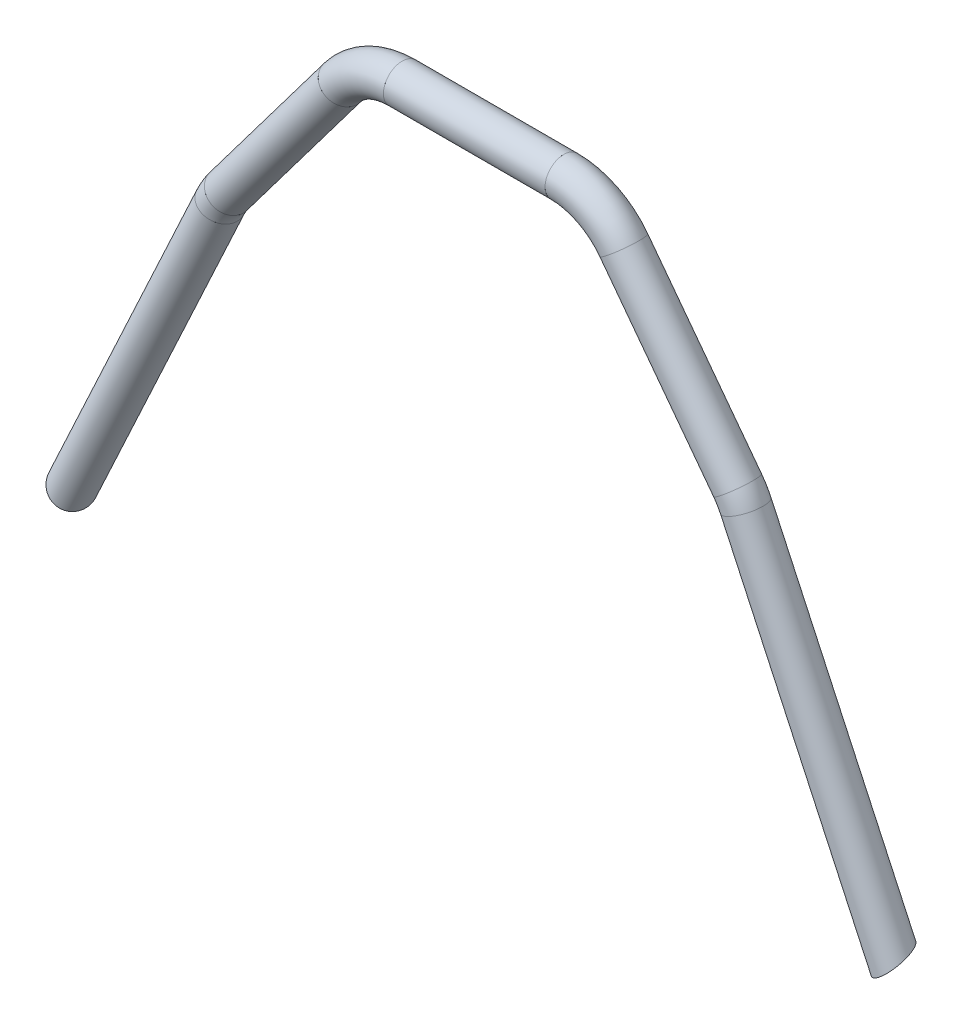
ISO-10303-21;
HEADER;
FILE_DESCRIPTION(('STEP AP214'),'2;1');
FILE_NAME('part.step','',(''),(''),'','','');
FILE_SCHEMA(('AUTOMOTIVE_DESIGN { 1 0 10303 214 1 1 1 1 }'));
ENDSEC;
DATA;
#1=APPLICATION_CONTEXT('core data for automotive mechanical design processes');
#2=APPLICATION_PROTOCOL_DEFINITION('international standard','automotive_design',2000,#1);
#3=PRODUCT_CONTEXT('',#1,'mechanical');
#4=PRODUCT('Part','Part','',(#3));
#5=PRODUCT_RELATED_PRODUCT_CATEGORY('part','',(#4));
#6=PRODUCT_DEFINITION_FORMATION('','',#4);
#7=PRODUCT_DEFINITION_CONTEXT('part definition',#1,'design');
#8=PRODUCT_DEFINITION('design','',#6,#7);
#9=PRODUCT_DEFINITION_SHAPE('','',#8);
#10=(LENGTH_UNIT() NAMED_UNIT(*) SI_UNIT(.MILLI.,.METRE.));
#11=(NAMED_UNIT(*) PLANE_ANGLE_UNIT() SI_UNIT($,.RADIAN.));
#12=(NAMED_UNIT(*) SI_UNIT($,.STERADIAN.) SOLID_ANGLE_UNIT());
#13=UNCERTAINTY_MEASURE_WITH_UNIT(LENGTH_MEASURE(1.E-05),#10,'distance_accuracy_value','');
#14=(GEOMETRIC_REPRESENTATION_CONTEXT(3) GLOBAL_UNCERTAINTY_ASSIGNED_CONTEXT((#13)) GLOBAL_UNIT_ASSIGNED_CONTEXT((#10,
#11,#12)) REPRESENTATION_CONTEXT('',''));
#15=CARTESIAN_POINT('',(0.,0.,0.));
#16=DIRECTION('',(0.,0.,1.));
#17=DIRECTION('',(1.,0.,0.));
#18=AXIS2_PLACEMENT_3D('',#15,#16,#17);
#19=CARTESIAN_POINT('',(204.,-156.,0.));
#20=DIRECTION('',(-0.421035813367489,0.907044014291467,0.));
#21=DIRECTION('',(-0.907044014291467,-0.42103581336749,0.));
#22=AXIS2_PLACEMENT_3D('',#19,#20,#21);
#23=CYLINDRICAL_SURFACE('',#22,6.35);
#24=CARTESIAN_POINT('',(208.290559359096,-165.243218892719,0.));
#25=DIRECTION('',(0.552110748805297,-0.77420389395875,-0.309486755181485));
#26=DIRECTION('',(0.267322110291044,0.515963819809947,-0.813830588019813));
#27=AXIS2_PLACEMENT_3D('',#24,#25,#26);
#28=ELLIPSE('',#27,6.79365701265662,6.35);
#29=CARTESIAN_POINT('',(210.106654088312,-161.73793766999,-5.52888588141529));
#30=VERTEX_POINT('',#29);
#31=EDGE_CURVE('E66',#30,#30,#28,.T.);
#32=ORIENTED_EDGE('',*,*,#31,.T.);
#33=EDGE_LOOP('',(#32));
#34=FACE_BOUND('',#33,.T.);
#35=CARTESIAN_POINT('',(133.28739155037,-3.66272560954052,0.));
#36=DIRECTION('',(-0.42103581336746,0.907044014291482,0.));
#37=DIRECTION('',(-0.907044014291482,-0.421035813367461,0.));
#38=AXIS2_PLACEMENT_3D('',#35,#36,#37);
#39=CIRCLE('',#38,6.35);
#40=CARTESIAN_POINT('',(127.527662059619,-6.3363030244239,0.));
#41=VERTEX_POINT('',#40);
#42=EDGE_CURVE('E53',#41,#41,#39,.T.);
#43=ORIENTED_EDGE('',*,*,#42,.T.);
#44=EDGE_LOOP('',(#43));
#45=FACE_BOUND('',#44,.T.);
#46=ADVANCED_FACE('F49',(#34,#45),#23,.F.);
#47=CARTESIAN_POINT('',(204.,-156.,0.));
#48=DIRECTION('',(-0.421035813367489,0.907044014291467,0.));
#49=DIRECTION('',(-0.907044014291467,-0.42103581336749,0.));
#50=AXIS2_PLACEMENT_3D('',#47,#48,#49);
#51=CYLINDRICAL_SURFACE('',#50,9.525);
#52=CARTESIAN_POINT('',(208.290559359096,-165.243218892719,0.));
#53=DIRECTION('',(0.552110748805297,-0.77420389395875,-0.309486755181485));
#54=DIRECTION('',(0.267322110291044,0.515963819809947,-0.813830588019813));
#55=AXIS2_PLACEMENT_3D('',#52,#53,#54);
#56=ELLIPSE('',#55,10.1904855189849,9.525);
#57=CARTESIAN_POINT('',(211.014701452921,-159.985297058626,-8.29332882212292));
#58=VERTEX_POINT('',#57);
#59=EDGE_CURVE('E58',#58,#58,#56,.T.);
#60=ORIENTED_EDGE('',*,*,#59,.F.);
#61=EDGE_LOOP('',(#60));
#62=FACE_BOUND('',#61,.T.);
#63=CARTESIAN_POINT('',(133.28739155037,-3.66272560954052,0.));
#64=DIRECTION('',(-0.42103581336746,0.907044014291482,0.));
#65=DIRECTION('',(-0.907044014291482,-0.421035813367461,0.));
#66=AXIS2_PLACEMENT_3D('',#63,#64,#65);
#67=CIRCLE('',#66,9.525);
#68=CARTESIAN_POINT('',(124.647797314243,-7.67309173186558,0.));
#69=VERTEX_POINT('',#68);
#70=EDGE_CURVE('E11',#69,#69,#67,.T.);
#71=ORIENTED_EDGE('',*,*,#70,.F.);
#72=EDGE_LOOP('',(#71));
#73=FACE_BOUND('',#72,.T.);
#74=ADVANCED_FACE('F80',(#62,#73),#51,.T.);
#75=CARTESIAN_POINT('',(201.736440615713,-166.866080536103,-7.63255151942821));
#76=DIRECTION('',(0.552110748805297,-0.77420389395875,-0.309486755181485));
#77=DIRECTION('',(0.814176924985191,0.580616857162848,0.));
#78=AXIS2_PLACEMENT_3D('',#75,#76,#77);
#79=PLANE('',#78);
#80=ORIENTED_EDGE('',*,*,#31,.F.);
#81=EDGE_LOOP('',(#80));
#82=FACE_BOUND('',#81,.T.);
#83=ORIENTED_EDGE('',*,*,#59,.T.);
#84=EDGE_LOOP('',(#83));
#85=FACE_BOUND('',#84,.T.);
#86=ADVANCED_FACE('F76',(#82,#85),#79,.T.);
#87=CARTESIAN_POINT('',(133.28739155037,-3.66272560954051,0.));
#88=DIRECTION('',(-0.42103581336746,0.907044014291482,0.));
#89=DIRECTION('',(-0.907044014291482,-0.421035813367461,0.));
#90=AXIS2_PLACEMENT_3D('',#87,#88,#89);
#91=PLANE('',#90);
#92=ORIENTED_EDGE('',*,*,#42,.F.);
#93=EDGE_LOOP('',(#92));
#94=FACE_BOUND('',#93,.T.);
#95=ORIENTED_EDGE('',*,*,#70,.T.);
#96=EDGE_LOOP('',(#95));
#97=FACE_BOUND('',#96,.T.);
#98=ADVANCED_FACE('F51',(#94,#97),#91,.T.);
#99=CLOSED_SHELL('',(#46,#74,#86,#98));
#100=MANIFOLD_SOLID_BREP('B2',#99);
#101=CARTESIAN_POINT('',(-98.7290146058647,-19.7041900988419,0.));
#102=DIRECTION('',(0.,0.,-1.));
#103=DIRECTION('',(-1.,0.,0.));
#104=AXIS2_PLACEMENT_3D('',#101,#102,#103);
#105=TOROIDAL_SURFACE('',#104,38.1,6.35);
#106=CARTESIAN_POINT('',(-133.28739155037,-3.66272560954051,0.));
#107=DIRECTION('',(-0.421035813367489,-0.907044014291466,0.));
#108=DIRECTION('',(0.907044014291467,-0.42103581336749,0.));
#109=AXIS2_PLACEMENT_3D('',#106,#107,#108);
#110=CIRCLE('',#109,6.35);
#111=CARTESIAN_POINT('',(-139.04712104112,-0.989148194656977,0.));
#112=VERTEX_POINT('',#111);
#113=EDGE_CURVE('E139',#112,#112,#110,.T.);
#114=CARTESIAN_POINT('',(-129.157027538666,3.22496228325135,0.));
#115=DIRECTION('',(0.601815023152052,0.79863551004729,0.));
#116=DIRECTION('',(-0.798635510047291,0.601815023152052,0.));
#117=AXIS2_PLACEMENT_3D('',#114,#115,#116);
#118=CIRCLE('',#117,6.35);
#119=CARTESIAN_POINT('',(-134.228363027467,7.04648768026686,0.));
#120=VERTEX_POINT('',#119);
#121=EDGE_CURVE('E48',#120,#120,#118,.T.);
#122=CARTESIAN_POINT('',(-98.7290146058647,-19.7041900988419,0.));
#123=DIRECTION('',(0.,0.,-1.));
#124=DIRECTION('',(-1.,0.,0.));
#125=AXIS2_PLACEMENT_3D('',#122,#123,#124);
#126=CIRCLE('',#125,44.45);
#127=EDGE_CURVE('',#112,#120,#126,.T.);
#128=ORIENTED_EDGE('',*,*,#113,.T.);
#129=ORIENTED_EDGE('',*,*,#121,.T.);
#130=ORIENTED_EDGE('',*,*,#127,.T.);
#131=ORIENTED_EDGE('',*,*,#127,.F.);
#132=EDGE_LOOP('',(#128,#130,#129,#131));
#133=FACE_BOUND('',#132,.T.);
#134=ADVANCED_FACE('F126',(#133),#105,.F.);
#135=CARTESIAN_POINT('',(-129.157027538667,3.22496228325124,0.));
#136=DIRECTION('',(0.601815023152052,0.79863551004729,0.));
#137=DIRECTION('',(-0.798635510047291,0.601815023152052,0.));
#138=AXIS2_PLACEMENT_3D('',#135,#136,#137);
#139=PLANE('',#138);
#140=ORIENTED_EDGE('',*,*,#121,.F.);
#141=EDGE_LOOP('',(#140));
#142=FACE_BOUND('',#141,.T.);
#143=CARTESIAN_POINT('',(-129.157027538666,3.22496228325135,0.));
#144=DIRECTION('',(0.601815023152052,0.79863551004729,0.));
#145=DIRECTION('',(-0.798635510047291,0.601815023152052,0.));
#146=AXIS2_PLACEMENT_3D('',#143,#144,#145);
#147=CIRCLE('',#146,9.525);
#148=CARTESIAN_POINT('',(-136.764030771867,8.95725037877463,0.));
#149=VERTEX_POINT('',#148);
#150=EDGE_CURVE('E133',#149,#149,#147,.F.);
#151=ORIENTED_EDGE('',*,*,#150,.F.);
#152=EDGE_LOOP('',(#151));
#153=FACE_BOUND('',#152,.T.);
#154=ADVANCED_FACE('F159',(#142,#153),#139,.T.);
#155=CARTESIAN_POINT('',(-98.7290146058647,-19.7041900988419,0.));
#156=DIRECTION('',(0.,0.,-1.));
#157=DIRECTION('',(-1.,0.,0.));
#158=AXIS2_PLACEMENT_3D('',#155,#156,#157);
#159=TOROIDAL_SURFACE('',#158,38.1,9.525);
#160=CARTESIAN_POINT('',(-133.28739155037,-3.66272560954051,0.));
#161=DIRECTION('',(-0.421035813367489,-0.907044014291466,0.));
#162=DIRECTION('',(0.907044014291467,-0.42103581336749,0.));
#163=AXIS2_PLACEMENT_3D('',#160,#161,#162);
#164=CIRCLE('',#163,9.525);
#165=CARTESIAN_POINT('',(-141.926985786496,0.3476405127848,0.));
#166=VERTEX_POINT('',#165);
#167=EDGE_CURVE('E144',#166,#166,#164,.F.);
#168=CARTESIAN_POINT('',(-98.7290146058647,-19.7041900988419,0.));
#169=DIRECTION('',(0.,0.,-1.));
#170=DIRECTION('',(-1.,0.,0.));
#171=AXIS2_PLACEMENT_3D('',#168,#169,#170);
#172=CIRCLE('',#171,47.625);
#173=EDGE_CURVE('',#166,#149,#172,.T.);
#174=ORIENTED_EDGE('',*,*,#167,.T.);
#175=ORIENTED_EDGE('',*,*,#150,.T.);
#176=ORIENTED_EDGE('',*,*,#173,.T.);
#177=ORIENTED_EDGE('',*,*,#173,.F.);
#178=EDGE_LOOP('',(#174,#176,#175,#177));
#179=FACE_BOUND('',#178,.T.);
#180=ADVANCED_FACE('F150',(#179),#159,.T.);
#181=CARTESIAN_POINT('',(-133.28739155037,-3.66272560954065,0.));
#182=DIRECTION('',(-0.421035813367489,-0.907044014291466,0.));
#183=DIRECTION('',(0.907044014291467,-0.42103581336749,0.));
#184=AXIS2_PLACEMENT_3D('',#181,#182,#183);
#185=PLANE('',#184);
#186=ORIENTED_EDGE('',*,*,#113,.F.);
#187=EDGE_LOOP('',(#186));
#188=FACE_BOUND('',#187,.T.);
#189=ORIENTED_EDGE('',*,*,#167,.F.);
#190=EDGE_LOOP('',(#189));
#191=FACE_BOUND('',#190,.T.);
#192=ADVANCED_FACE('F152',(#188,#191),#185,.T.);
#193=CLOSED_SHELL('',(#134,#154,#180,#192));
#194=MANIFOLD_SOLID_BREP('B6',#193);
#195=CARTESIAN_POINT('',(-71.4316298348404,79.8291523820928,0.));
#196=DIRECTION('',(-0.601815023152046,-0.798635510047294,0.));
#197=DIRECTION('',(0.798635510047295,-0.601815023152047,0.));
#198=AXIS2_PLACEMENT_3D('',#195,#196,#197);
#199=CYLINDRICAL_SURFACE('',#198,6.35);
#200=CARTESIAN_POINT('',(-71.4316298348404,79.8291523820929,0.));
#201=DIRECTION('',(0.601815023152052,0.79863551004729,0.));
#202=DIRECTION('',(-0.798635510047291,0.601815023152053,0.));
#203=AXIS2_PLACEMENT_3D('',#200,#201,#202);
#204=CIRCLE('',#203,6.35);
#205=CARTESIAN_POINT('',(-76.5029653236407,83.6506777791084,0.));
#206=VERTEX_POINT('',#205);
#207=EDGE_CURVE('E220',#206,#206,#204,.T.);
#208=ORIENTED_EDGE('',*,*,#207,.T.);
#209=EDGE_LOOP('',(#208));
#210=FACE_BOUND('',#209,.T.);
#211=CARTESIAN_POINT('',(-129.157027538667,3.22496228325128,0.));
#212=DIRECTION('',(-0.601815023152052,-0.79863551004729,0.));
#213=DIRECTION('',(0.798635510047291,-0.601815023152053,0.));
#214=AXIS2_PLACEMENT_3D('',#211,#212,#213);
#215=CIRCLE('',#214,6.35);
#216=CARTESIAN_POINT('',(-124.085692049866,-0.596563113764252,0.));
#217=VERTEX_POINT('',#216);
#218=EDGE_CURVE('E207',#217,#217,#215,.T.);
#219=ORIENTED_EDGE('',*,*,#218,.T.);
#220=EDGE_LOOP('',(#219));
#221=FACE_BOUND('',#220,.T.);
#222=ADVANCED_FACE('F203',(#210,#221),#199,.F.);
#223=CARTESIAN_POINT('',(-71.4316298348404,79.8291523820928,0.));
#224=DIRECTION('',(-0.601815023152046,-0.798635510047294,0.));
#225=DIRECTION('',(0.798635510047295,-0.601815023152047,0.));
#226=AXIS2_PLACEMENT_3D('',#223,#224,#225);
#227=CYLINDRICAL_SURFACE('',#226,9.525);
#228=CARTESIAN_POINT('',(-71.4316298348404,79.8291523820929,0.));
#229=DIRECTION('',(0.601815023152052,0.79863551004729,0.));
#230=DIRECTION('',(-0.798635510047291,0.601815023152053,0.));
#231=AXIS2_PLACEMENT_3D('',#228,#229,#230);
#232=CIRCLE('',#231,9.525);
#233=CARTESIAN_POINT('',(-79.0386330680408,85.5614404776162,0.));
#234=VERTEX_POINT('',#233);
#235=EDGE_CURVE('E212',#234,#234,#232,.T.);
#236=ORIENTED_EDGE('',*,*,#235,.F.);
#237=EDGE_LOOP('',(#236));
#238=FACE_BOUND('',#237,.T.);
#239=CARTESIAN_POINT('',(-129.157027538667,3.22496228325128,0.));
#240=DIRECTION('',(-0.601815023152052,-0.79863551004729,0.));
#241=DIRECTION('',(0.798635510047291,-0.601815023152053,0.));
#242=AXIS2_PLACEMENT_3D('',#239,#240,#241);
#243=CIRCLE('',#242,9.525);
#244=CARTESIAN_POINT('',(-121.550024305466,-2.50732581227202,0.));
#245=VERTEX_POINT('',#244);
#246=EDGE_CURVE('E125',#245,#245,#243,.T.);
#247=ORIENTED_EDGE('',*,*,#246,.F.);
#248=EDGE_LOOP('',(#247));
#249=FACE_BOUND('',#248,.T.);
#250=ADVANCED_FACE('F234',(#238,#249),#227,.T.);
#251=CARTESIAN_POINT('',(-71.4316298348404,79.8291523820928,0.));
#252=DIRECTION('',(0.601815023152052,0.79863551004729,0.));
#253=DIRECTION('',(-0.798635510047291,0.601815023152053,0.));
#254=AXIS2_PLACEMENT_3D('',#251,#252,#253);
#255=PLANE('',#254);
#256=ORIENTED_EDGE('',*,*,#207,.F.);
#257=EDGE_LOOP('',(#256));
#258=FACE_BOUND('',#257,.T.);
#259=ORIENTED_EDGE('',*,*,#235,.T.);
#260=EDGE_LOOP('',(#259));
#261=FACE_BOUND('',#260,.T.);
#262=ADVANCED_FACE('F230',(#258,#261),#255,.T.);
#263=CARTESIAN_POINT('',(-129.157027538667,3.22496228325124,0.));
#264=DIRECTION('',(-0.601815023152052,-0.79863551004729,0.));
#265=DIRECTION('',(0.798635510047291,-0.601815023152053,0.));
#266=AXIS2_PLACEMENT_3D('',#263,#264,#265);
#267=PLANE('',#266);
#268=ORIENTED_EDGE('',*,*,#218,.F.);
#269=EDGE_LOOP('',(#268));
#270=FACE_BOUND('',#269,.T.);
#271=ORIENTED_EDGE('',*,*,#246,.T.);
#272=EDGE_LOOP('',(#271));
#273=FACE_BOUND('',#272,.T.);
#274=ADVANCED_FACE('F205',(#270,#273),#267,.T.);
#275=CLOSED_SHELL('',(#222,#250,#262,#274));
#276=MANIFOLD_SOLID_BREP('B43',#275);
#277=CARTESIAN_POINT('',(-41.0036169020383,56.8999999999999,0.));
#278=DIRECTION('',(0.,0.,-1.));
#279=DIRECTION('',(-1.,0.,0.));
#280=AXIS2_PLACEMENT_3D('',#277,#278,#279);
#281=TOROIDAL_SURFACE('',#280,38.1,6.35);
#282=CARTESIAN_POINT('',(-71.4316298348401,79.8291523820932,0.));
#283=DIRECTION('',(-0.601815023152053,-0.798635510047291,0.));
#284=DIRECTION('',(0.798635510047291,-0.601815023152053,0.));
#285=AXIS2_PLACEMENT_3D('',#282,#283,#284);
#286=CIRCLE('',#285,6.35);
#287=CARTESIAN_POINT('',(-76.5029653236403,83.6506777791087,0.));
#288=VERTEX_POINT('',#287);
#289=EDGE_CURVE('E292',#288,#288,#286,.T.);
#290=CARTESIAN_POINT('',(-41.0036169020377,95.,0.));
#291=DIRECTION('',(1.,0.,0.));
#292=DIRECTION('',(0.,1.,0.));
#293=AXIS2_PLACEMENT_3D('',#290,#291,#292);
#294=CIRCLE('',#293,6.35);
#295=CARTESIAN_POINT('',(-41.0036169020376,101.35,0.));
#296=VERTEX_POINT('',#295);
#297=EDGE_CURVE('E202',#296,#296,#294,.T.);
#298=CARTESIAN_POINT('',(-41.0036169020383,56.8999999999999,0.));
#299=DIRECTION('',(0.,0.,-1.));
#300=DIRECTION('',(-1.,0.,0.));
#301=AXIS2_PLACEMENT_3D('',#298,#299,#300);
#302=CIRCLE('',#301,44.45);
#303=EDGE_CURVE('',#288,#296,#302,.T.);
#304=ORIENTED_EDGE('',*,*,#289,.T.);
#305=ORIENTED_EDGE('',*,*,#297,.T.);
#306=ORIENTED_EDGE('',*,*,#303,.T.);
#307=ORIENTED_EDGE('',*,*,#303,.F.);
#308=EDGE_LOOP('',(#304,#306,#305,#307));
#309=FACE_BOUND('',#308,.T.);
#310=ADVANCED_FACE('F280',(#309),#281,.F.);
#311=CARTESIAN_POINT('',(-41.0036169020382,95.,0.));
#312=DIRECTION('',(1.,0.,0.));
#313=DIRECTION('',(0.,1.,0.));
#314=AXIS2_PLACEMENT_3D('',#311,#312,#313);
#315=PLANE('',#314);
#316=ORIENTED_EDGE('',*,*,#297,.F.);
#317=EDGE_LOOP('',(#316));
#318=FACE_BOUND('',#317,.T.);
#319=CARTESIAN_POINT('',(-41.0036169020377,95.,0.));
#320=DIRECTION('',(1.,0.,0.));
#321=DIRECTION('',(0.,1.,0.));
#322=AXIS2_PLACEMENT_3D('',#319,#320,#321);
#323=CIRCLE('',#322,9.525);
#324=CARTESIAN_POINT('',(-41.0036169020376,104.525,0.));
#325=VERTEX_POINT('',#324);
#326=EDGE_CURVE('E287',#325,#325,#323,.F.);
#327=ORIENTED_EDGE('',*,*,#326,.F.);
#328=EDGE_LOOP('',(#327));
#329=FACE_BOUND('',#328,.T.);
#330=ADVANCED_FACE('F313',(#318,#329),#315,.T.);
#331=CARTESIAN_POINT('',(-41.0036169020383,56.8999999999999,0.));
#332=DIRECTION('',(0.,0.,-1.));
#333=DIRECTION('',(-1.,0.,0.));
#334=AXIS2_PLACEMENT_3D('',#331,#332,#333);
#335=TOROIDAL_SURFACE('',#334,38.1,9.525);
#336=CARTESIAN_POINT('',(-71.4316298348401,79.8291523820932,0.));
#337=DIRECTION('',(-0.601815023152053,-0.798635510047291,0.));
#338=DIRECTION('',(0.798635510047291,-0.601815023152053,0.));
#339=AXIS2_PLACEMENT_3D('',#336,#337,#338);
#340=CIRCLE('',#339,9.525);
#341=CARTESIAN_POINT('',(-79.0386330680405,85.5614404776165,0.));
#342=VERTEX_POINT('',#341);
#343=EDGE_CURVE('E297',#342,#342,#340,.F.);
#344=CARTESIAN_POINT('',(-41.0036169020383,56.8999999999999,0.));
#345=DIRECTION('',(0.,0.,-1.));
#346=DIRECTION('',(-1.,0.,0.));
#347=AXIS2_PLACEMENT_3D('',#344,#345,#346);
#348=CIRCLE('',#347,47.625);
#349=EDGE_CURVE('',#342,#325,#348,.T.);
#350=ORIENTED_EDGE('',*,*,#343,.T.);
#351=ORIENTED_EDGE('',*,*,#326,.T.);
#352=ORIENTED_EDGE('',*,*,#349,.T.);
#353=ORIENTED_EDGE('',*,*,#349,.F.);
#354=EDGE_LOOP('',(#350,#352,#351,#353));
#355=FACE_BOUND('',#354,.T.);
#356=ADVANCED_FACE('F304',(#355),#335,.T.);
#357=CARTESIAN_POINT('',(-71.4316298348403,79.8291523820928,0.));
#358=DIRECTION('',(-0.601815023152053,-0.798635510047291,0.));
#359=DIRECTION('',(0.798635510047291,-0.601815023152053,0.));
#360=AXIS2_PLACEMENT_3D('',#357,#358,#359);
#361=PLANE('',#360);
#362=ORIENTED_EDGE('',*,*,#289,.F.);
#363=EDGE_LOOP('',(#362));
#364=FACE_BOUND('',#363,.T.);
#365=ORIENTED_EDGE('',*,*,#343,.F.);
#366=EDGE_LOOP('',(#365));
#367=FACE_BOUND('',#366,.T.);
#368=ADVANCED_FACE('F306',(#364,#367),#361,.T.);
#369=CLOSED_SHELL('',(#310,#330,#356,#368));
#370=MANIFOLD_SOLID_BREP('B120',#369);
#371=CARTESIAN_POINT('',(41.0036169020381,95.,0.));
#372=DIRECTION('',(-1.,0.,0.));
#373=DIRECTION('',(0.,-1.,0.));
#374=AXIS2_PLACEMENT_3D('',#371,#372,#373);
#375=CYLINDRICAL_SURFACE('',#374,6.35);
#376=CARTESIAN_POINT('',(41.0036169020382,95.,0.));
#377=DIRECTION('',(1.,0.,0.));
#378=DIRECTION('',(0.,1.,0.));
#379=AXIS2_PLACEMENT_3D('',#376,#377,#378);
#380=CIRCLE('',#379,6.35);
#381=CARTESIAN_POINT('',(41.0036169020383,101.35,0.));
#382=VERTEX_POINT('',#381);
#383=EDGE_CURVE('E373',#382,#382,#380,.T.);
#384=ORIENTED_EDGE('',*,*,#383,.T.);
#385=EDGE_LOOP('',(#384));
#386=FACE_BOUND('',#385,.T.);
#387=CARTESIAN_POINT('',(-41.0036169020382,95.,0.));
#388=DIRECTION('',(-1.,0.,0.));
#389=DIRECTION('',(0.,-1.,0.));
#390=AXIS2_PLACEMENT_3D('',#387,#388,#389);
#391=CIRCLE('',#390,6.35);
#392=CARTESIAN_POINT('',(-41.0036169020383,88.65,0.));
#393=VERTEX_POINT('',#392);
#394=EDGE_CURVE('E361',#393,#393,#391,.T.);
#395=ORIENTED_EDGE('',*,*,#394,.T.);
#396=EDGE_LOOP('',(#395));
#397=FACE_BOUND('',#396,.T.);
#398=ADVANCED_FACE('F357',(#386,#397),#375,.F.);
#399=CARTESIAN_POINT('',(41.0036169020381,95.,0.));
#400=DIRECTION('',(-1.,0.,0.));
#401=DIRECTION('',(0.,-1.,0.));
#402=AXIS2_PLACEMENT_3D('',#399,#400,#401);
#403=CYLINDRICAL_SURFACE('',#402,9.525);
#404=CARTESIAN_POINT('',(41.0036169020382,95.,0.));
#405=DIRECTION('',(1.,0.,0.));
#406=DIRECTION('',(0.,1.,0.));
#407=AXIS2_PLACEMENT_3D('',#404,#405,#406);
#408=CIRCLE('',#407,9.525);
#409=CARTESIAN_POINT('',(41.0036169020383,104.525,0.));
#410=VERTEX_POINT('',#409);
#411=EDGE_CURVE('E366',#410,#410,#408,.T.);
#412=ORIENTED_EDGE('',*,*,#411,.F.);
#413=EDGE_LOOP('',(#412));
#414=FACE_BOUND('',#413,.T.);
#415=CARTESIAN_POINT('',(-41.0036169020382,95.,0.));
#416=DIRECTION('',(-1.,0.,0.));
#417=DIRECTION('',(0.,-1.,0.));
#418=AXIS2_PLACEMENT_3D('',#415,#416,#417);
#419=CIRCLE('',#418,9.525);
#420=CARTESIAN_POINT('',(-41.0036169020383,85.475,0.));
#421=VERTEX_POINT('',#420);
#422=EDGE_CURVE('E279',#421,#421,#419,.T.);
#423=ORIENTED_EDGE('',*,*,#422,.F.);
#424=EDGE_LOOP('',(#423));
#425=FACE_BOUND('',#424,.T.);
#426=ADVANCED_FACE('F388',(#414,#425),#403,.T.);
#427=CARTESIAN_POINT('',(41.0036169020382,95.,0.));
#428=DIRECTION('',(1.,0.,0.));
#429=DIRECTION('',(0.,1.,0.));
#430=AXIS2_PLACEMENT_3D('',#427,#428,#429);
#431=PLANE('',#430);
#432=ORIENTED_EDGE('',*,*,#383,.F.);
#433=EDGE_LOOP('',(#432));
#434=FACE_BOUND('',#433,.T.);
#435=ORIENTED_EDGE('',*,*,#411,.T.);
#436=EDGE_LOOP('',(#435));
#437=FACE_BOUND('',#436,.T.);
#438=ADVANCED_FACE('F384',(#434,#437),#431,.T.);
#439=CARTESIAN_POINT('',(-41.0036169020382,95.,0.));
#440=DIRECTION('',(-1.,0.,0.));
#441=DIRECTION('',(0.,-1.,0.));
#442=AXIS2_PLACEMENT_3D('',#439,#440,#441);
#443=PLANE('',#442);
#444=ORIENTED_EDGE('',*,*,#394,.F.);
#445=EDGE_LOOP('',(#444));
#446=FACE_BOUND('',#445,.T.);
#447=ORIENTED_EDGE('',*,*,#422,.T.);
#448=EDGE_LOOP('',(#447));
#449=FACE_BOUND('',#448,.T.);
#450=ADVANCED_FACE('F359',(#446,#449),#443,.T.);
#451=CLOSED_SHELL('',(#398,#426,#438,#450));
#452=MANIFOLD_SOLID_BREP('B197',#451);
#453=CARTESIAN_POINT('',(41.0036169020383,56.8999999999999,0.));
#454=DIRECTION('',(0.,0.,1.));
#455=DIRECTION('',(1.,0.,0.));
#456=AXIS2_PLACEMENT_3D('',#453,#454,#455);
#457=TOROIDAL_SURFACE('',#456,38.1,6.35);
#458=CARTESIAN_POINT('',(71.4316298348409,79.8291523820922,0.));
#459=DIRECTION('',(0.601815023152026,-0.79863551004731,0.));
#460=DIRECTION('',(0.798635510047311,0.601815023152029,0.));
#461=AXIS2_PLACEMENT_3D('',#458,#459,#460);
#462=CIRCLE('',#461,6.35);
#463=CARTESIAN_POINT('',(76.5029653236412,83.6506777791076,0.));
#464=VERTEX_POINT('',#463);
#465=EDGE_CURVE('E448',#464,#464,#462,.F.);
#466=CARTESIAN_POINT('',(41.0036169020389,95.,0.));
#467=DIRECTION('',(-1.,0.,0.));
#468=DIRECTION('',(0.,-1.,0.));
#469=AXIS2_PLACEMENT_3D('',#466,#467,#468);
#470=CIRCLE('',#469,6.35);
#471=CARTESIAN_POINT('',(41.003616902039,101.35,0.));
#472=VERTEX_POINT('',#471);
#473=EDGE_CURVE('E356',#472,#472,#470,.F.);
#474=CARTESIAN_POINT('',(41.0036169020383,56.8999999999999,0.));
#475=DIRECTION('',(0.,0.,1.));
#476=DIRECTION('',(1.,0.,0.));
#477=AXIS2_PLACEMENT_3D('',#474,#475,#476);
#478=CIRCLE('',#477,44.45);
#479=EDGE_CURVE('',#464,#472,#478,.T.);
#480=ORIENTED_EDGE('',*,*,#465,.F.);
#481=ORIENTED_EDGE('',*,*,#473,.F.);
#482=ORIENTED_EDGE('',*,*,#479,.T.);
#483=ORIENTED_EDGE('',*,*,#479,.F.);
#484=EDGE_LOOP('',(#480,#482,#481,#483));
#485=FACE_BOUND('',#484,.T.);
#486=ADVANCED_FACE('F434',(#485),#457,.F.);
#487=CARTESIAN_POINT('',(41.0036169020383,56.8999999999999,0.));
#488=DIRECTION('',(0.,0.,1.));
#489=DIRECTION('',(1.,0.,0.));
#490=AXIS2_PLACEMENT_3D('',#487,#488,#489);
#491=TOROIDAL_SURFACE('',#490,38.1,9.525);
#492=CARTESIAN_POINT('',(71.4316298348409,79.8291523820922,0.));
#493=DIRECTION('',(0.601815023152026,-0.79863551004731,0.));
#494=DIRECTION('',(0.798635510047311,0.601815023152029,0.));
#495=AXIS2_PLACEMENT_3D('',#492,#493,#494);
#496=CIRCLE('',#495,9.525);
#497=CARTESIAN_POINT('',(79.0386330680414,85.5614404776152,0.));
#498=VERTEX_POINT('',#497);
#499=EDGE_CURVE('E454',#498,#498,#496,.T.);
#500=CARTESIAN_POINT('',(41.0036169020389,95.,0.));
#501=DIRECTION('',(-1.,0.,0.));
#502=DIRECTION('',(0.,-1.,0.));
#503=AXIS2_PLACEMENT_3D('',#500,#501,#502);
#504=CIRCLE('',#503,9.525);
#505=CARTESIAN_POINT('',(41.0036169020391,104.525,0.));
#506=VERTEX_POINT('',#505);
#507=EDGE_CURVE('E442',#506,#506,#504,.T.);
#508=CARTESIAN_POINT('',(41.0036169020383,56.8999999999999,0.));
#509=DIRECTION('',(0.,0.,1.));
#510=DIRECTION('',(1.,0.,0.));
#511=AXIS2_PLACEMENT_3D('',#508,#509,#510);
#512=CIRCLE('',#511,47.625);
#513=EDGE_CURVE('',#498,#506,#512,.T.);
#514=ORIENTED_EDGE('',*,*,#499,.F.);
#515=ORIENTED_EDGE('',*,*,#507,.F.);
#516=ORIENTED_EDGE('',*,*,#513,.T.);
#517=ORIENTED_EDGE('',*,*,#513,.F.);
#518=EDGE_LOOP('',(#514,#516,#515,#517));
#519=FACE_BOUND('',#518,.T.);
#520=ADVANCED_FACE('F462',(#519),#491,.T.);
#521=CARTESIAN_POINT('',(71.4316298348404,79.8291523820928,0.));
#522=DIRECTION('',(0.601815023152026,-0.79863551004731,0.));
#523=DIRECTION('',(0.798635510047311,0.601815023152029,0.));
#524=AXIS2_PLACEMENT_3D('',#521,#522,#523);
#525=PLANE('',#524);
#526=ORIENTED_EDGE('',*,*,#499,.T.);
#527=EDGE_LOOP('',(#526));
#528=FACE_BOUND('',#527,.T.);
#529=ORIENTED_EDGE('',*,*,#465,.T.);
#530=EDGE_LOOP('',(#529));
#531=FACE_BOUND('',#530,.T.);
#532=ADVANCED_FACE('F459',(#528,#531),#525,.T.);
#533=CARTESIAN_POINT('',(41.0036169020382,95.,0.));
#534=DIRECTION('',(-1.,0.,0.));
#535=DIRECTION('',(0.,-1.,0.));
#536=AXIS2_PLACEMENT_3D('',#533,#534,#535);
#537=PLANE('',#536);
#538=ORIENTED_EDGE('',*,*,#507,.T.);
#539=EDGE_LOOP('',(#538));
#540=FACE_BOUND('',#539,.T.);
#541=ORIENTED_EDGE('',*,*,#473,.T.);
#542=EDGE_LOOP('',(#541));
#543=FACE_BOUND('',#542,.T.);
#544=ADVANCED_FACE('F436',(#540,#543),#537,.T.);
#545=CLOSED_SHELL('',(#486,#520,#532,#544));
#546=MANIFOLD_SOLID_BREP('B274',#545);
#547=CARTESIAN_POINT('',(129.157027538667,3.2249622832513,0.));
#548=DIRECTION('',(-0.601815023152047,0.798635510047294,0.));
#549=DIRECTION('',(-0.798635510047296,-0.601815023152047,0.));
#550=AXIS2_PLACEMENT_3D('',#547,#548,#549);
#551=CYLINDRICAL_SURFACE('',#550,6.35);
#552=CARTESIAN_POINT('',(129.157027538667,3.22496228325134,0.));
#553=DIRECTION('',(0.601815023152026,-0.798635510047309,0.));
#554=DIRECTION('',(0.79863551004731,0.601815023152027,0.));
#555=AXIS2_PLACEMENT_3D('',#552,#553,#554);
#556=CIRCLE('',#555,6.35);
#557=CARTESIAN_POINT('',(124.085692049866,-0.596563113764035,0.));
#558=VERTEX_POINT('',#557);
#559=EDGE_CURVE('E528',#558,#558,#556,.T.);
#560=CARTESIAN_POINT('',(71.4316298348404,79.8291523820928,0.));
#561=DIRECTION('',(-0.601815023152026,0.798635510047309,0.));
#562=DIRECTION('',(-0.79863551004731,-0.601815023152027,0.));
#563=AXIS2_PLACEMENT_3D('',#560,#561,#562);
#564=CIRCLE('',#563,6.35);
#565=CARTESIAN_POINT('',(66.36029434604,76.0076269850775,0.));
#566=VERTEX_POINT('',#565);
#567=EDGE_CURVE('E515',#566,#566,#564,.T.);
#568=CARTESIAN_POINT('',(124.085692049866,-0.596563113764035,0.));
#569=CARTESIAN_POINT('',(123.484385823785,0.201397199765561,0.));
#570=CARTESIAN_POINT('',(122.883079597703,0.999357513295161,0.));
#571=CARTESIAN_POINT('',(121.68046714554,2.59527814035436,0.));
#572=CARTESIAN_POINT('',(121.079160919459,3.39323845388396,0.));
#573=CARTESIAN_POINT('',(119.876548467295,4.98915908094316,0.));
#574=CARTESIAN_POINT('',(119.275242241214,5.78711939447276,0.));
#575=CARTESIAN_POINT('',(118.072629789051,7.38304002153195,0.));
#576=CARTESIAN_POINT('',(117.471323562969,8.18100033506155,0.));
#577=CARTESIAN_POINT('',(116.268711110806,9.77692096212075,0.));
#578=CARTESIAN_POINT('',(115.667404884725,10.5748812756503,0.));
#579=CARTESIAN_POINT('',(114.464792432562,12.1708019027095,0.));
#580=CARTESIAN_POINT('',(113.86348620648,12.9687622162391,0.));
#581=CARTESIAN_POINT('',(112.660873754317,14.5646828432983,0.));
#582=CARTESIAN_POINT('',(112.059567528236,15.3626431568279,0.));
#583=CARTESIAN_POINT('',(110.856955076073,16.9585637838871,0.));
#584=CARTESIAN_POINT('',(110.255648849991,17.7565240974167,0.));
#585=CARTESIAN_POINT('',(109.053036397828,19.3524447244759,0.));
#586=CARTESIAN_POINT('',(108.451730171747,20.1504050380055,0.));
#587=CARTESIAN_POINT('',(107.249117719584,21.7463256650647,0.));
#588=CARTESIAN_POINT('',(106.647811493502,22.5442859785943,0.));
#589=CARTESIAN_POINT('',(105.445199041339,24.1402066056535,0.));
#590=CARTESIAN_POINT('',(104.843892815257,24.9381669191831,0.));
#591=CARTESIAN_POINT('',(103.641280363094,26.5340875462423,0.));
#592=CARTESIAN_POINT('',(103.039974137013,27.3320478597719,0.));
#593=CARTESIAN_POINT('',(101.83736168485,28.9279684868311,0.));
#594=CARTESIAN_POINT('',(101.236055458768,29.7259288003607,0.));
#595=CARTESIAN_POINT('',(100.033443006605,31.3218494274199,0.));
#596=CARTESIAN_POINT('',(99.4321367805237,32.1198097409495,0.));
#597=CARTESIAN_POINT('',(98.2295243283607,33.7157303680087,0.));
#598=CARTESIAN_POINT('',(97.6282181022792,34.5136906815383,0.));
#599=CARTESIAN_POINT('',(96.4256056501161,36.1096113085975,0.));
#600=CARTESIAN_POINT('',(95.8242994240346,36.9075716221271,0.));
#601=CARTESIAN_POINT('',(94.6216869718715,38.5034922491863,0.));
#602=CARTESIAN_POINT('',(94.02038074579,39.3014525627159,0.));
#603=CARTESIAN_POINT('',(92.817768293627,40.8973731897751,0.));
#604=CARTESIAN_POINT('',(92.2164620675455,41.6953335033047,0.));
#605=CARTESIAN_POINT('',(91.0138496153824,43.2912541303639,0.));
#606=CARTESIAN_POINT('',(90.4125433893009,44.0892144438935,0.));
#607=CARTESIAN_POINT('',(89.2099309371378,45.6851350709527,0.));
#608=CARTESIAN_POINT('',(88.6086247110563,46.4830953844823,0.));
#609=CARTESIAN_POINT('',(87.4060122588933,48.0790160115415,0.));
#610=CARTESIAN_POINT('',(86.8047060328118,48.8769763250711,0.));
#611=CARTESIAN_POINT('',(85.6020935806487,50.4728969521303,0.));
#612=CARTESIAN_POINT('',(85.0007873545672,51.2708572656599,0.));
#613=CARTESIAN_POINT('',(83.7981749024041,52.8667778927191,0.));
#614=CARTESIAN_POINT('',(83.1968686763226,53.6647382062487,0.));
#615=CARTESIAN_POINT('',(81.9942562241596,55.2606588333079,0.));
#616=CARTESIAN_POINT('',(81.3929499980781,56.0586191468375,0.));
#617=CARTESIAN_POINT('',(80.190337545915,57.6545397738967,0.));
#618=CARTESIAN_POINT('',(79.5890313198335,58.4525000874263,0.));
#619=CARTESIAN_POINT('',(78.3864188676704,60.0484207144855,0.));
#620=CARTESIAN_POINT('',(77.7851126415889,60.8463810280151,0.));
#621=CARTESIAN_POINT('',(76.5825001894259,62.4423016550743,0.));
#622=CARTESIAN_POINT('',(75.9811939633444,63.2402619686039,0.));
#623=CARTESIAN_POINT('',(74.7785815111813,64.8361825956631,0.));
#624=CARTESIAN_POINT('',(74.1772752850998,65.6341429091927,0.));
#625=CARTESIAN_POINT('',(72.9746628329367,67.2300635362519,0.));
#626=CARTESIAN_POINT('',(72.3733566068552,68.0280238497815,0.));
#627=CARTESIAN_POINT('',(71.1707441546922,69.6239444768407,0.));
#628=CARTESIAN_POINT('',(70.5694379286107,70.4219047903702,0.));
#629=CARTESIAN_POINT('',(69.3668254764476,72.0178254174295,0.));
#630=CARTESIAN_POINT('',(68.7655192503661,72.815785730959,0.));
#631=CARTESIAN_POINT('',(67.562906798203,74.4117063580183,0.));
#632=CARTESIAN_POINT('',(66.9616005721215,75.2096666715479,0.));
#633=CARTESIAN_POINT('',(66.36029434604,76.0076269850775,0.));
#634=B_SPLINE_CURVE_WITH_KNOTS('',3,(#568,#569,#570,#571,#572,#573,#574,#575,#576,#577,#578,
#579,#580,#581,#582,#583,#584,#585,#586,#587,#588,#589,#590,#591,#592,#593,#594,#595,#596,#597,
#598,#599,#600,#601,#602,#603,#604,#605,#606,#607,#608,#609,#610,#611,#612,#613,#614,#615,#616,
#617,#618,#619,#620,#621,#622,#623,#624,#625,#626,#627,#628,#629,#630,#631,#632,#633),
.UNSPECIFIED.,.F.,.F.,(4,2,2,2,2,2,2,2,2,2,2,2,2,2,2,2,2,2,2,2,2,2,2,2,2,2,2,2,2,2,2,2,4),(0.,
2.9974636870918,5.99492737418359,8.99239106127538,11.9898547483672,14.987318435459,
17.9847821225508,20.9822458096425,23.9797094967343,26.9771731838261,29.9746368709179,
32.9721005580097,35.9695642451015,38.9670279321933,41.9644916192851,44.9619553063769,
47.9594189934687,50.9568826805605,53.9543463676523,56.9518100547441,59.9492737418359,
62.9467374289277,65.9442011160194,68.9416648031112,71.939128490203,74.9365921772948,
77.9340558643866,80.9315195514784,83.9289832385702,86.926446925662,89.9239106127538,
92.9213742998456,95.9188379869374),.UNSPECIFIED.);
#635=EDGE_CURVE('BSEAM511',#558,#566,#634,.T.);
#636=ORIENTED_EDGE('',*,*,#559,.T.);
#637=ORIENTED_EDGE('',*,*,#567,.T.);
#638=ORIENTED_EDGE('',*,*,#635,.T.);
#639=ORIENTED_EDGE('',*,*,#635,.F.);
#640=EDGE_LOOP('',(#636,#638,#637,#639));
#641=FACE_BOUND('',#640,.T.);
#642=ADVANCED_FACE('F511',(#641),#551,.F.);
#643=CARTESIAN_POINT('',(129.157027538667,3.2249622832513,0.));
#644=DIRECTION('',(-0.601815023152047,0.798635510047294,0.));
#645=DIRECTION('',(-0.798635510047296,-0.601815023152047,0.));
#646=AXIS2_PLACEMENT_3D('',#643,#644,#645);
#647=CYLINDRICAL_SURFACE('',#646,9.525);
#648=CARTESIAN_POINT('',(129.157027538667,3.22496228325134,0.));
#649=DIRECTION('',(0.601815023152026,-0.798635510047309,0.));
#650=DIRECTION('',(0.79863551004731,0.601815023152027,0.));
#651=AXIS2_PLACEMENT_3D('',#648,#649,#650);
#652=CIRCLE('',#651,9.525);
#653=CARTESIAN_POINT('',(121.550024305466,-2.50732581227172,0.));
#654=VERTEX_POINT('',#653);
#655=EDGE_CURVE('E520',#654,#654,#652,.T.);
#656=CARTESIAN_POINT('',(71.4316298348404,79.8291523820928,0.));
#657=DIRECTION('',(-0.601815023152026,0.798635510047309,0.));
#658=DIRECTION('',(-0.79863551004731,-0.601815023152027,0.));
#659=AXIS2_PLACEMENT_3D('',#656,#657,#658);
#660=CIRCLE('',#659,9.525);
#661=CARTESIAN_POINT('',(63.8246266016398,74.0968642865698,0.));
#662=VERTEX_POINT('',#661);
#663=EDGE_CURVE('E433',#662,#662,#660,.T.);
#664=CARTESIAN_POINT('',(121.550024305466,-2.50732581227172,0.));
#665=CARTESIAN_POINT('',(120.948718079384,-1.70936549874212,0.));
#666=CARTESIAN_POINT('',(120.347411853303,-0.911405185212523,0.));
#667=CARTESIAN_POINT('',(119.14479940114,0.684515441846672,0.));
#668=CARTESIAN_POINT('',(118.543493175058,1.48247575537627,0.));
#669=CARTESIAN_POINT('',(117.340880722895,3.07839638243547,0.));
#670=CARTESIAN_POINT('',(116.739574496814,3.87635669596507,0.));
#671=CARTESIAN_POINT('',(115.536962044651,5.47227732302427,0.));
#672=CARTESIAN_POINT('',(114.935655818569,6.27023763655386,0.));
#673=CARTESIAN_POINT('',(113.733043366406,7.86615826361306,0.));
#674=CARTESIAN_POINT('',(113.131737140325,8.66411857714266,0.));
#675=CARTESIAN_POINT('',(111.929124688162,10.2600392042019,0.));
#676=CARTESIAN_POINT('',(111.32781846208,11.0579995177315,0.));
#677=CARTESIAN_POINT('',(110.125206009917,12.6539201447907,0.));
#678=CARTESIAN_POINT('',(109.523899783835,13.4518804583203,0.));
#679=CARTESIAN_POINT('',(108.321287331672,15.0478010853795,0.));
#680=CARTESIAN_POINT('',(107.719981105591,15.845761398909,0.));
#681=CARTESIAN_POINT('',(106.517368653428,17.4416820259682,0.));
#682=CARTESIAN_POINT('',(105.916062427346,18.2396423394978,0.));
#683=CARTESIAN_POINT('',(104.713449975183,19.835562966557,0.));
#684=CARTESIAN_POINT('',(104.112143749102,20.6335232800866,0.));
#685=CARTESIAN_POINT('',(102.909531296939,22.2294439071458,0.));
#686=CARTESIAN_POINT('',(102.308225070857,23.0274042206754,0.));
#687=CARTESIAN_POINT('',(101.105612618694,24.6233248477346,0.));
#688=CARTESIAN_POINT('',(100.504306392613,25.4212851612642,0.));
#689=CARTESIAN_POINT('',(99.3016939404496,27.0172057883234,0.));
#690=CARTESIAN_POINT('',(98.7003877143681,27.815166101853,0.));
#691=CARTESIAN_POINT('',(97.497775262205,29.4110867289122,0.));
#692=CARTESIAN_POINT('',(96.8964690361235,30.2090470424418,0.));
#693=CARTESIAN_POINT('',(95.6938565839605,31.804967669501,0.));
#694=CARTESIAN_POINT('',(95.0925503578789,32.6029279830306,0.));
#695=CARTESIAN_POINT('',(93.8899379057159,34.1988486100898,0.));
#696=CARTESIAN_POINT('',(93.2886316796344,34.9968089236194,0.));
#697=CARTESIAN_POINT('',(92.0860192274713,36.5927295506786,0.));
#698=CARTESIAN_POINT('',(91.4847130013898,37.3906898642082,0.));
#699=CARTESIAN_POINT('',(90.2821005492268,38.9866104912674,0.));
#700=CARTESIAN_POINT('',(89.6807943231452,39.784570804797,0.));
#701=CARTESIAN_POINT('',(88.4781818709822,41.3804914318562,0.));
#702=CARTESIAN_POINT('',(87.8768756449007,42.1784517453858,0.));
#703=CARTESIAN_POINT('',(86.6742631927376,43.774372372445,0.));
#704=CARTESIAN_POINT('',(86.0729569666561,44.5723326859746,0.));
#705=CARTESIAN_POINT('',(84.8703445144931,46.1682533130338,0.));
#706=CARTESIAN_POINT('',(84.2690382884116,46.9662136265634,0.));
#707=CARTESIAN_POINT('',(83.0664258362485,48.5621342536226,0.));
#708=CARTESIAN_POINT('',(82.465119610167,49.3600945671522,0.));
#709=CARTESIAN_POINT('',(81.2625071580039,50.9560151942114,0.));
#710=CARTESIAN_POINT('',(80.6612009319224,51.753975507741,0.));
#711=CARTESIAN_POINT('',(79.4585884797594,53.3498961348002,0.));
#712=CARTESIAN_POINT('',(78.8572822536778,54.1478564483298,0.));
#713=CARTESIAN_POINT('',(77.6546698015148,55.743777075389,0.));
#714=CARTESIAN_POINT('',(77.0533635754333,56.5417373889186,0.));
#715=CARTESIAN_POINT('',(75.8507511232702,58.1376580159778,0.));
#716=CARTESIAN_POINT('',(75.2494448971887,58.9356183295074,0.));
#717=CARTESIAN_POINT('',(74.0468324450257,60.5315389565666,0.));
#718=CARTESIAN_POINT('',(73.4455262189442,61.3294992700962,0.));
#719=CARTESIAN_POINT('',(72.2429137667811,62.9254198971554,0.));
#720=CARTESIAN_POINT('',(71.6416075406996,63.723380210685,0.));
#721=CARTESIAN_POINT('',(70.4389950885365,65.3193008377442,0.));
#722=CARTESIAN_POINT('',(69.837688862455,66.1172611512738,0.));
#723=CARTESIAN_POINT('',(68.635076410292,67.713181778333,0.));
#724=CARTESIAN_POINT('',(68.0337701842105,68.5111420918626,0.));
#725=CARTESIAN_POINT('',(66.8311577320474,70.1070627189218,0.));
#726=CARTESIAN_POINT('',(66.2298515059659,70.9050230324514,0.));
#727=CARTESIAN_POINT('',(65.0272390538028,72.5009436595106,0.));
#728=CARTESIAN_POINT('',(64.4259328277213,73.2989039730402,0.));
#729=CARTESIAN_POINT('',(63.8246266016398,74.0968642865698,0.));
#730=B_SPLINE_CURVE_WITH_KNOTS('',3,(#664,#665,#666,#667,#668,#669,#670,#671,#672,#673,#674,
#675,#676,#677,#678,#679,#680,#681,#682,#683,#684,#685,#686,#687,#688,#689,#690,#691,#692,#693,
#694,#695,#696,#697,#698,#699,#700,#701,#702,#703,#704,#705,#706,#707,#708,#709,#710,#711,#712,
#713,#714,#715,#716,#717,#718,#719,#720,#721,#722,#723,#724,#725,#726,#727,#728,#729),
.UNSPECIFIED.,.F.,.F.,(4,2,2,2,2,2,2,2,2,2,2,2,2,2,2,2,2,2,2,2,2,2,2,2,2,2,2,2,2,2,2,2,4),(0.,
2.99746368709179,5.99492737418358,8.99239106127537,11.9898547483672,14.987318435459,
17.9847821225508,20.9822458096425,23.9797094967343,26.9771731838261,29.9746368709179,
32.9721005580097,35.9695642451015,38.9670279321933,41.9644916192851,44.9619553063769,
47.9594189934687,50.9568826805605,53.9543463676523,56.9518100547441,59.9492737418358,
62.9467374289276,65.9442011160194,68.9416648031112,71.939128490203,74.9365921772948,
77.9340558643866,80.9315195514784,83.9289832385702,86.926446925662,89.9239106127538,
92.9213742998456,95.9188379869374),.UNSPECIFIED.);
#731=EDGE_CURVE('BSEAM542',#654,#662,#730,.T.);
#732=ORIENTED_EDGE('',*,*,#655,.F.);
#733=ORIENTED_EDGE('',*,*,#663,.F.);
#734=ORIENTED_EDGE('',*,*,#731,.T.);
#735=ORIENTED_EDGE('',*,*,#731,.F.);
#736=EDGE_LOOP('',(#732,#734,#733,#735));
#737=FACE_BOUND('',#736,.T.);
#738=ADVANCED_FACE('F542',(#737),#647,.T.);
#739=CARTESIAN_POINT('',(129.157027538667,3.22496228325129,0.));
#740=DIRECTION('',(0.601815023152026,-0.798635510047309,0.));
#741=DIRECTION('',(0.79863551004731,0.601815023152027,0.));
#742=AXIS2_PLACEMENT_3D('',#739,#740,#741);
#743=PLANE('',#742);
#744=ORIENTED_EDGE('',*,*,#559,.F.);
#745=EDGE_LOOP('',(#744));
#746=FACE_BOUND('',#745,.T.);
#747=ORIENTED_EDGE('',*,*,#655,.T.);
#748=EDGE_LOOP('',(#747));
#749=FACE_BOUND('',#748,.T.);
#750=ADVANCED_FACE('F538',(#746,#749),#743,.T.);
#751=CARTESIAN_POINT('',(71.4316298348404,79.8291523820928,0.));
#752=DIRECTION('',(-0.601815023152026,0.798635510047309,0.));
#753=DIRECTION('',(-0.79863551004731,-0.601815023152027,0.));
#754=AXIS2_PLACEMENT_3D('',#751,#752,#753);
#755=PLANE('',#754);
#756=ORIENTED_EDGE('',*,*,#567,.F.);
#757=EDGE_LOOP('',(#756));
#758=FACE_BOUND('',#757,.T.);
#759=ORIENTED_EDGE('',*,*,#663,.T.);
#760=EDGE_LOOP('',(#759));
#761=FACE_BOUND('',#760,.T.);
#762=ADVANCED_FACE('F513',(#758,#761),#755,.T.);
#763=CLOSED_SHELL('',(#642,#738,#750,#762));
#764=MANIFOLD_SOLID_BREP('B351',#763);
#765=CARTESIAN_POINT('',(98.7290146058646,-19.7041900988419,0.));
#766=DIRECTION('',(0.,0.,1.));
#767=DIRECTION('',(1.,0.,0.));
#768=AXIS2_PLACEMENT_3D('',#765,#766,#767);
#769=TOROIDAL_SURFACE('',#768,38.1,6.35);
#770=CARTESIAN_POINT('',(133.28739155037,-3.66272560954162,0.));
#771=DIRECTION('',(0.42103581336746,-0.90704401429148,0.));
#772=DIRECTION('',(0.907044014291481,0.421035813367461,0.));
#773=AXIS2_PLACEMENT_3D('',#770,#771,#772);
#774=CIRCLE('',#773,6.35);
#775=CARTESIAN_POINT('',(139.047121041121,-0.989148194658285,0.));
#776=VERTEX_POINT('',#775);
#777=EDGE_CURVE('E601',#776,#776,#774,.F.);
#778=CARTESIAN_POINT('',(129.157027538667,3.22496228325037,0.));
#779=DIRECTION('',(-0.601815023152027,0.798635510047309,0.));
#780=DIRECTION('',(-0.798635510047311,-0.601815023152028,0.));
#781=AXIS2_PLACEMENT_3D('',#778,#779,#780);
#782=CIRCLE('',#781,6.35);
#783=CARTESIAN_POINT('',(134.228363027468,7.04648768026567,0.));
#784=VERTEX_POINT('',#783);
#785=EDGE_CURVE('E510',#784,#784,#782,.F.);
#786=CARTESIAN_POINT('',(98.7290146058646,-19.7041900988419,0.));
#787=DIRECTION('',(0.,0.,1.));
#788=DIRECTION('',(1.,0.,0.));
#789=AXIS2_PLACEMENT_3D('',#786,#787,#788);
#790=CIRCLE('',#789,44.45);
#791=EDGE_CURVE('',#776,#784,#790,.T.);
#792=ORIENTED_EDGE('',*,*,#777,.F.);
#793=ORIENTED_EDGE('',*,*,#785,.F.);
#794=ORIENTED_EDGE('',*,*,#791,.T.);
#795=ORIENTED_EDGE('',*,*,#791,.F.);
#796=EDGE_LOOP('',(#792,#794,#793,#795));
#797=FACE_BOUND('',#796,.T.);
#798=ADVANCED_FACE('F587',(#797),#769,.F.);
#799=CARTESIAN_POINT('',(98.7290146058646,-19.7041900988419,0.));
#800=DIRECTION('',(0.,0.,1.));
#801=DIRECTION('',(1.,0.,0.));
#802=AXIS2_PLACEMENT_3D('',#799,#800,#801);
#803=TOROIDAL_SURFACE('',#802,38.1,9.525);
#804=CARTESIAN_POINT('',(133.28739155037,-3.66272560954162,0.));
#805=DIRECTION('',(0.42103581336746,-0.90704401429148,0.));
#806=DIRECTION('',(0.907044014291481,0.421035813367461,0.));
#807=AXIS2_PLACEMENT_3D('',#804,#805,#806);
#808=CIRCLE('',#807,9.525);
#809=CARTESIAN_POINT('',(141.926985786496,0.347640512783399,0.));
#810=VERTEX_POINT('',#809);
#811=EDGE_CURVE('E606',#810,#810,#808,.T.);
#812=CARTESIAN_POINT('',(129.157027538667,3.22496228325037,0.));
#813=DIRECTION('',(-0.601815023152027,0.798635510047309,0.));
#814=DIRECTION('',(-0.798635510047311,-0.601815023152028,0.));
#815=AXIS2_PLACEMENT_3D('',#812,#813,#814);
#816=CIRCLE('',#815,9.525);
#817=CARTESIAN_POINT('',(136.764030771868,8.95725037877335,0.));
#818=VERTEX_POINT('',#817);
#819=EDGE_CURVE('E595',#818,#818,#816,.T.);
#820=CARTESIAN_POINT('',(98.7290146058646,-19.7041900988419,0.));
#821=DIRECTION('',(0.,0.,1.));
#822=DIRECTION('',(1.,0.,0.));
#823=AXIS2_PLACEMENT_3D('',#820,#821,#822);
#824=CIRCLE('',#823,47.625);
#825=EDGE_CURVE('',#810,#818,#824,.T.);
#826=ORIENTED_EDGE('',*,*,#811,.F.);
#827=ORIENTED_EDGE('',*,*,#819,.F.);
#828=ORIENTED_EDGE('',*,*,#825,.T.);
#829=ORIENTED_EDGE('',*,*,#825,.F.);
#830=EDGE_LOOP('',(#826,#828,#827,#829));
#831=FACE_BOUND('',#830,.T.);
#832=ADVANCED_FACE('F615',(#831),#803,.T.);
#833=CARTESIAN_POINT('',(133.28739155037,-3.6627256095406,0.));
#834=DIRECTION('',(0.42103581336746,-0.90704401429148,0.));
#835=DIRECTION('',(0.907044014291481,0.421035813367461,0.));
#836=AXIS2_PLACEMENT_3D('',#833,#834,#835);
#837=PLANE('',#836);
#838=ORIENTED_EDGE('',*,*,#811,.T.);
#839=EDGE_LOOP('',(#838));
#840=FACE_BOUND('',#839,.T.);
#841=ORIENTED_EDGE('',*,*,#777,.T.);
#842=EDGE_LOOP('',(#841));
#843=FACE_BOUND('',#842,.T.);
#844=ADVANCED_FACE('F612',(#840,#843),#837,.T.);
#845=CARTESIAN_POINT('',(129.157027538667,3.22496228325127,0.));
#846=DIRECTION('',(-0.601815023152027,0.798635510047309,0.));
#847=DIRECTION('',(-0.798635510047311,-0.601815023152028,0.));
#848=AXIS2_PLACEMENT_3D('',#845,#846,#847);
#849=PLANE('',#848);
#850=ORIENTED_EDGE('',*,*,#819,.T.);
#851=EDGE_LOOP('',(#850));
#852=FACE_BOUND('',#851,.T.);
#853=ORIENTED_EDGE('',*,*,#785,.T.);
#854=EDGE_LOOP('',(#853));
#855=FACE_BOUND('',#854,.T.);
#856=ADVANCED_FACE('F589',(#852,#855),#849,.T.);
#857=CLOSED_SHELL('',(#798,#832,#844,#856));
#858=MANIFOLD_SOLID_BREP('B428',#857);
#859=CARTESIAN_POINT('',(-133.28739155037,-3.66272560954063,0.));
#860=DIRECTION('',(-0.421035813367489,-0.907044014291466,0.));
#861=DIRECTION('',(0.907044014291467,-0.42103581336749,0.));
#862=AXIS2_PLACEMENT_3D('',#859,#860,#861);
#863=CYLINDRICAL_SURFACE('',#862,6.35);
#864=CARTESIAN_POINT('',(-133.28739155037,-3.66272560954062,0.));
#865=DIRECTION('',(0.421035813367489,0.907044014291467,0.));
#866=DIRECTION('',(-0.907044014291467,0.42103581336749,0.));
#867=AXIS2_PLACEMENT_3D('',#864,#865,#866);
#868=CIRCLE('',#867,6.35);
#869=CARTESIAN_POINT('',(-139.04712104112,-0.989148194657059,0.));
#870=VERTEX_POINT('',#869);
#871=EDGE_CURVE('E674',#870,#870,#868,.T.);
#872=ORIENTED_EDGE('',*,*,#871,.T.);
#873=EDGE_LOOP('',(#872));
#874=FACE_BOUND('',#873,.T.);
#875=CARTESIAN_POINT('',(-208.290559359095,-165.243218892719,0.));
#876=DIRECTION('',(-0.552110748805322,-0.77420389395874,-0.309486755181469));
#877=DIRECTION('',(0.267322110291111,-0.515963819809976,0.813830588019775));
#878=AXIS2_PLACEMENT_3D('',#875,#876,#877);
#879=ELLIPSE('',#878,6.79365701265662,6.35);
#880=CARTESIAN_POINT('',(-206.474464629878,-168.748500115448,5.52888588141498));
#881=VERTEX_POINT('',#880);
#882=EDGE_CURVE('E660',#881,#881,#879,.T.);
#883=ORIENTED_EDGE('',*,*,#882,.T.);
#884=EDGE_LOOP('',(#883));
#885=FACE_BOUND('',#884,.T.);
#886=ADVANCED_FACE('F656',(#874,#885),#863,.F.);
#887=CARTESIAN_POINT('',(-133.28739155037,-3.66272560954063,0.));
#888=DIRECTION('',(-0.421035813367489,-0.907044014291466,0.));
#889=DIRECTION('',(0.907044014291467,-0.42103581336749,0.));
#890=AXIS2_PLACEMENT_3D('',#887,#888,#889);
#891=CYLINDRICAL_SURFACE('',#890,9.525);
#892=CARTESIAN_POINT('',(-133.28739155037,-3.66272560954062,0.));
#893=DIRECTION('',(0.421035813367489,0.907044014291467,0.));
#894=DIRECTION('',(-0.907044014291467,0.42103581336749,0.));
#895=AXIS2_PLACEMENT_3D('',#892,#893,#894);
#896=CIRCLE('',#895,9.525);
#897=CARTESIAN_POINT('',(-141.926985786496,0.34764051278472,0.));
#898=VERTEX_POINT('',#897);
#899=EDGE_CURVE('E665',#898,#898,#896,.T.);
#900=ORIENTED_EDGE('',*,*,#899,.F.);
#901=EDGE_LOOP('',(#900));
#902=FACE_BOUND('',#901,.T.);
#903=CARTESIAN_POINT('',(-208.290559359095,-165.243218892719,0.));
#904=DIRECTION('',(-0.552110748805322,-0.77420389395874,-0.309486755181469));
#905=DIRECTION('',(0.267322110291111,-0.515963819809976,0.813830588019775));
#906=AXIS2_PLACEMENT_3D('',#903,#904,#905);
#907=ELLIPSE('',#906,10.1904855189849,9.525);
#908=CARTESIAN_POINT('',(-205.566417265269,-170.501140726813,8.29332882212248));
#909=VERTEX_POINT('',#908);
#910=EDGE_CURVE('E586',#909,#909,#907,.T.);
#911=ORIENTED_EDGE('',*,*,#910,.F.);
#912=EDGE_LOOP('',(#911));
#913=FACE_BOUND('',#912,.T.);
#914=ADVANCED_FACE('F687',(#902,#913),#891,.T.);
#915=CARTESIAN_POINT('',(-133.28739155037,-3.66272560954059,0.));
#916=DIRECTION('',(0.421035813367489,0.907044014291467,0.));
#917=DIRECTION('',(-0.907044014291467,0.42103581336749,0.));
#918=AXIS2_PLACEMENT_3D('',#915,#916,#917);
#919=PLANE('',#918);
#920=ORIENTED_EDGE('',*,*,#871,.F.);
#921=EDGE_LOOP('',(#920));
#922=FACE_BOUND('',#921,.T.);
#923=ORIENTED_EDGE('',*,*,#899,.T.);
#924=EDGE_LOOP('',(#923));
#925=FACE_BOUND('',#924,.T.);
#926=ADVANCED_FACE('F683',(#922,#925),#919,.T.);
#927=CARTESIAN_POINT('',(-216.781269149028,-159.882503643811,1.73682883322113));
#928=DIRECTION('',(-0.552110748805322,-0.77420389395874,-0.309486755181469));
#929=DIRECTION('',(0.814176924985175,-0.580616857162869,0.));
#930=AXIS2_PLACEMENT_3D('',#927,#928,#929);
#931=PLANE('',#930);
#932=ORIENTED_EDGE('',*,*,#882,.F.);
#933=EDGE_LOOP('',(#932));
#934=FACE_BOUND('',#933,.T.);
#935=ORIENTED_EDGE('',*,*,#910,.T.);
#936=EDGE_LOOP('',(#935));
#937=FACE_BOUND('',#936,.T.);
#938=ADVANCED_FACE('F658',(#934,#937),#931,.T.);
#939=CLOSED_SHELL('',(#886,#914,#926,#938));
#940=MANIFOLD_SOLID_BREP('B505',#939);
#941=ADVANCED_BREP_SHAPE_REPRESENTATION('',(#18,#100,#194,#276,#370,#452,#546,#764,#858,#940),#14);
#942=SHAPE_DEFINITION_REPRESENTATION(#9,#941);
ENDSEC;
END-ISO-10303-21;
